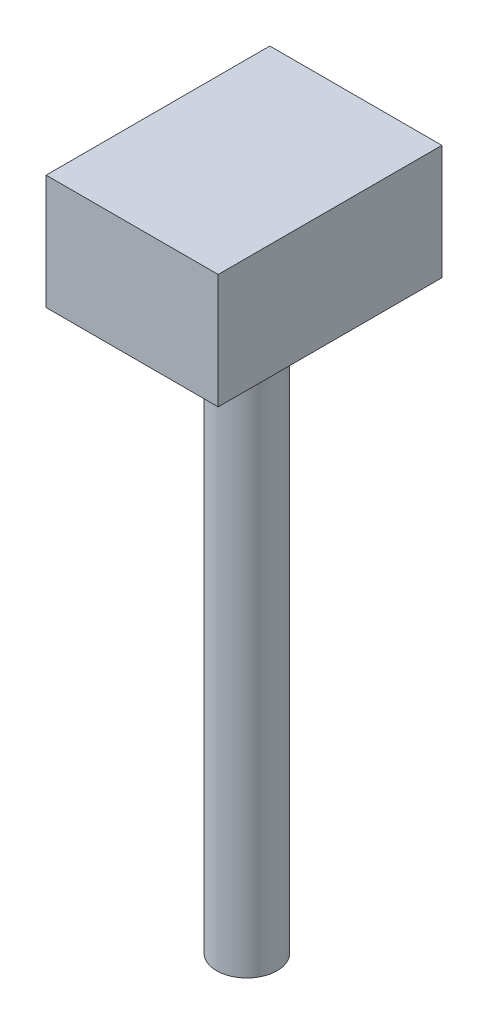
ISO-10303-21;
HEADER;
FILE_DESCRIPTION(('STEP AP214'),'2;1');
FILE_NAME('part.step','',(''),(''),'','','');
FILE_SCHEMA(('AUTOMOTIVE_DESIGN { 1 0 10303 214 1 1 1 1 }'));
ENDSEC;
DATA;
#1=APPLICATION_CONTEXT('core data for automotive mechanical design processes');
#2=APPLICATION_PROTOCOL_DEFINITION('international standard','automotive_design',2000,#1);
#3=PRODUCT_CONTEXT('',#1,'mechanical');
#4=PRODUCT('Part','Part','',(#3));
#5=PRODUCT_RELATED_PRODUCT_CATEGORY('part','',(#4));
#6=PRODUCT_DEFINITION_FORMATION('','',#4);
#7=PRODUCT_DEFINITION_CONTEXT('part definition',#1,'design');
#8=PRODUCT_DEFINITION('design','',#6,#7);
#9=PRODUCT_DEFINITION_SHAPE('','',#8);
#10=(LENGTH_UNIT() NAMED_UNIT(*) SI_UNIT(.MILLI.,.METRE.));
#11=(NAMED_UNIT(*) PLANE_ANGLE_UNIT() SI_UNIT($,.RADIAN.));
#12=(NAMED_UNIT(*) SI_UNIT($,.STERADIAN.) SOLID_ANGLE_UNIT());
#13=UNCERTAINTY_MEASURE_WITH_UNIT(LENGTH_MEASURE(1.E-05),#10,'distance_accuracy_value','');
#14=(GEOMETRIC_REPRESENTATION_CONTEXT(3) GLOBAL_UNCERTAINTY_ASSIGNED_CONTEXT((#13)) GLOBAL_UNIT_ASSIGNED_CONTEXT((#10,
#11,#12)) REPRESENTATION_CONTEXT('',''));
#15=CARTESIAN_POINT('',(0.,0.,0.));
#16=DIRECTION('',(0.,0.,1.));
#17=DIRECTION('',(1.,0.,0.));
#18=AXIS2_PLACEMENT_3D('',#15,#16,#17);
#19=CARTESIAN_POINT('',(-24.9395760630972,27.9290165452646,400.));
#20=DIRECTION('',(1.,0.,0.));
#21=DIRECTION('',(0.,0.,-1.));
#22=AXIS2_PLACEMENT_3D('',#19,#20,#21);
#23=PLANE('',#22);
#24=DIRECTION('',(0.,0.,-1.));
#25=VECTOR('',#24,1.);
#26=CARTESIAN_POINT('',(-24.9395760630972,27.9290165452646,400.));
#27=LINE('',#26,#25);
#28=CARTESIAN_POINT('',(-24.9395760630972,27.9290165452646,400.));
#29=VERTEX_POINT('',#28);
#30=CARTESIAN_POINT('',(-24.9395760630972,27.9290165452646,10.));
#31=VERTEX_POINT('',#30);
#32=EDGE_CURVE('E117',#29,#31,#27,.T.);
#33=ORIENTED_EDGE('',*,*,#32,.T.);
#34=DIRECTION('',(0.,-1.,0.));
#35=VECTOR('',#34,1.);
#36=CARTESIAN_POINT('',(-24.9395760630972,328.095636941337,10.));
#37=LINE('',#36,#35);
#38=CARTESIAN_POINT('',(-24.9395760630972,-172.070983454735,10.));
#39=VERTEX_POINT('',#38);
#40=EDGE_CURVE('E47',#31,#39,#37,.T.);
#41=ORIENTED_EDGE('',*,*,#40,.T.);
#42=DIRECTION('',(0.,0.,-1.));
#43=VECTOR('',#42,1.);
#44=CARTESIAN_POINT('',(-24.9395760630972,-172.070983454735,400.));
#45=LINE('',#44,#43);
#46=CARTESIAN_POINT('',(-24.9395760630972,-172.070983454735,400.));
#47=VERTEX_POINT('',#46);
#48=EDGE_CURVE('E111',#47,#39,#45,.T.);
#49=ORIENTED_EDGE('',*,*,#48,.F.);
#50=DIRECTION('',(0.,-1.,0.));
#51=VECTOR('',#50,1.);
#52=CARTESIAN_POINT('',(-24.9395760630972,27.9290165452646,400.));
#53=LINE('',#52,#51);
#54=EDGE_CURVE('E127',#29,#47,#53,.T.);
#55=ORIENTED_EDGE('',*,*,#54,.F.);
#56=EDGE_LOOP('',(#33,#41,#49,#55));
#57=FACE_BOUND('',#56,.T.);
#58=ADVANCED_FACE('F33',(#57),#23,.F.);
#59=CARTESIAN_POINT('',(-24.9395760630972,-172.070983454735,400.));
#60=DIRECTION('',(0.,1.,0.));
#61=DIRECTION('',(0.,0.,1.));
#62=AXIS2_PLACEMENT_3D('',#59,#60,#61);
#63=PLANE('',#62);
#64=CARTESIAN_POINT('',(45.0604239369028,-172.070983454735,15.));
#65=DIRECTION('',(0.,-1.,0.));
#66=DIRECTION('',(0.,0.,1.));
#67=AXIS2_PLACEMENT_3D('',#64,#65,#66);
#68=CIRCLE('',#67,3.5);
#69=CARTESIAN_POINT('',(45.0604239369028,-172.070983454735,18.5));
#70=VERTEX_POINT('',#69);
#71=EDGE_CURVE('E163',#70,#70,#68,.T.);
#72=ORIENTED_EDGE('',*,*,#71,.F.);
#73=EDGE_LOOP('',(#72));
#74=FACE_BOUND('',#73,.T.);
#75=CARTESIAN_POINT('',(205.060423936903,-172.070983454735,15.));
#76=DIRECTION('',(0.,-1.,0.));
#77=DIRECTION('',(0.,0.,-1.));
#78=AXIS2_PLACEMENT_3D('',#75,#76,#77);
#79=CIRCLE('',#78,3.49999999999999);
#80=CARTESIAN_POINT('',(205.060423936903,-172.070983454735,11.5));
#81=VERTEX_POINT('',#80);
#82=EDGE_CURVE('E164',#81,#81,#79,.T.);
#83=ORIENTED_EDGE('',*,*,#82,.F.);
#84=EDGE_LOOP('',(#83));
#85=FACE_BOUND('',#84,.T.);
#86=CARTESIAN_POINT('',(125.060423936903,-172.070983454735,200.));
#87=DIRECTION('',(0.,-1.,0.));
#88=DIRECTION('',(0.,0.,-1.));
#89=AXIS2_PLACEMENT_3D('',#86,#87,#88);
#90=CIRCLE('',#89,52.8064596683049);
#91=CARTESIAN_POINT('',(125.060423936903,-172.070983454735,147.193540331695));
#92=VERTEX_POINT('',#91);
#93=EDGE_CURVE('E40',#92,#92,#90,.T.);
#94=ORIENTED_EDGE('',*,*,#93,.F.);
#95=EDGE_LOOP('',(#94));
#96=FACE_BOUND('',#95,.T.);
#97=ORIENTED_EDGE('',*,*,#48,.T.);
#98=DIRECTION('',(-1.,0.,0.));
#99=VECTOR('',#98,1.);
#100=CARTESIAN_POINT('',(-24.9395760630972,-172.070983454735,10.));
#101=LINE('',#100,#99);
#102=CARTESIAN_POINT('',(275.060423936903,-172.070983454735,10.));
#103=VERTEX_POINT('',#102);
#104=EDGE_CURVE('E97',#103,#39,#101,.T.);
#105=ORIENTED_EDGE('',*,*,#104,.F.);
#106=DIRECTION('',(0.,0.,-1.));
#107=VECTOR('',#106,1.);
#108=CARTESIAN_POINT('',(275.060423936903,-172.070983454735,400.));
#109=LINE('',#108,#107);
#110=CARTESIAN_POINT('',(275.060423936903,-172.070983454735,400.));
#111=VERTEX_POINT('',#110);
#112=EDGE_CURVE('E108',#111,#103,#109,.T.);
#113=ORIENTED_EDGE('',*,*,#112,.F.);
#114=DIRECTION('',(1.,0.,0.));
#115=VECTOR('',#114,1.);
#116=CARTESIAN_POINT('',(-24.9395760630972,-172.070983454735,400.));
#117=LINE('',#116,#115);
#118=EDGE_CURVE('E125',#47,#111,#117,.T.);
#119=ORIENTED_EDGE('',*,*,#118,.F.);
#120=EDGE_LOOP('',(#97,#105,#113,#119));
#121=FACE_BOUND('',#120,.T.);
#122=ADVANCED_FACE('F107',(#74,#85,#96,#121),#63,.F.);
#123=CARTESIAN_POINT('',(275.060423936903,27.9290165452646,400.));
#124=DIRECTION('',(-1.,0.,0.));
#125=DIRECTION('',(0.,0.,1.));
#126=AXIS2_PLACEMENT_3D('',#123,#124,#125);
#127=PLANE('',#126);
#128=ORIENTED_EDGE('',*,*,#112,.T.);
#129=DIRECTION('',(0.,-1.,0.));
#130=VECTOR('',#129,1.);
#131=CARTESIAN_POINT('',(275.060423936903,328.095636941337,10.));
#132=LINE('',#131,#130);
#133=CARTESIAN_POINT('',(275.060423936903,27.9290165452646,10.));
#134=VERTEX_POINT('',#133);
#135=EDGE_CURVE('E94',#134,#103,#132,.T.);
#136=ORIENTED_EDGE('',*,*,#135,.F.);
#137=DIRECTION('',(0.,0.,-1.));
#138=VECTOR('',#137,1.);
#139=CARTESIAN_POINT('',(275.060423936903,27.9290165452646,400.));
#140=LINE('',#139,#138);
#141=CARTESIAN_POINT('',(275.060423936903,27.9290165452646,400.));
#142=VERTEX_POINT('',#141);
#143=EDGE_CURVE('E115',#142,#134,#140,.T.);
#144=ORIENTED_EDGE('',*,*,#143,.F.);
#145=DIRECTION('',(0.,1.,0.));
#146=VECTOR('',#145,1.);
#147=CARTESIAN_POINT('',(275.060423936903,27.9290165452646,400.));
#148=LINE('',#147,#146);
#149=EDGE_CURVE('E114',#111,#142,#148,.T.);
#150=ORIENTED_EDGE('',*,*,#149,.F.);
#151=EDGE_LOOP('',(#128,#136,#144,#150));
#152=FACE_BOUND('',#151,.T.);
#153=ADVANCED_FACE('F113',(#152),#127,.F.);
#154=CARTESIAN_POINT('',(-24.9395760630972,27.9290165452646,400.));
#155=DIRECTION('',(0.,-1.,0.));
#156=DIRECTION('',(1.,0.,0.));
#157=AXIS2_PLACEMENT_3D('',#154,#155,#156);
#158=PLANE('',#157);
#159=ORIENTED_EDGE('',*,*,#143,.T.);
#160=DIRECTION('',(1.,0.,0.));
#161=VECTOR('',#160,1.);
#162=CARTESIAN_POINT('',(-24.9395760630972,27.9290165452646,10.));
#163=LINE('',#162,#161);
#164=EDGE_CURVE('E98',#31,#134,#163,.T.);
#165=ORIENTED_EDGE('',*,*,#164,.F.);
#166=ORIENTED_EDGE('',*,*,#32,.F.);
#167=DIRECTION('',(-1.,0.,0.));
#168=VECTOR('',#167,1.);
#169=CARTESIAN_POINT('',(-24.9395760630972,27.9290165452646,400.));
#170=LINE('',#169,#168);
#171=EDGE_CURVE('E122',#142,#29,#170,.T.);
#172=ORIENTED_EDGE('',*,*,#171,.F.);
#173=EDGE_LOOP('',(#159,#165,#166,#172));
#174=FACE_BOUND('',#173,.T.);
#175=ADVANCED_FACE('F184',(#174),#158,.F.);
#176=CARTESIAN_POINT('',(0.,0.,400.));
#177=DIRECTION('',(0.,0.,1.));
#178=DIRECTION('',(1.,0.,0.));
#179=AXIS2_PLACEMENT_3D('',#176,#177,#178);
#180=PLANE('',#179);
#181=ORIENTED_EDGE('',*,*,#54,.T.);
#182=ORIENTED_EDGE('',*,*,#118,.T.);
#183=ORIENTED_EDGE('',*,*,#149,.T.);
#184=ORIENTED_EDGE('',*,*,#171,.T.);
#185=EDGE_LOOP('',(#181,#182,#183,#184));
#186=FACE_BOUND('',#185,.T.);
#187=ADVANCED_FACE('F186',(#186),#180,.T.);
#188=CARTESIAN_POINT('',(265.060423936903,22.9290165452646,390.));
#189=DIRECTION('',(1.,0.,0.));
#190=DIRECTION('',(0.,1.,0.));
#191=AXIS2_PLACEMENT_3D('',#188,#189,#190);
#192=PLANE('',#191);
#193=DIRECTION('',(0.,0.,-1.));
#194=VECTOR('',#193,1.);
#195=CARTESIAN_POINT('',(265.060423936903,22.9290165452646,390.));
#196=LINE('',#195,#194);
#197=CARTESIAN_POINT('',(265.060423936903,22.9290165452646,390.));
#198=VERTEX_POINT('',#197);
#199=CARTESIAN_POINT('',(265.060423936903,22.9290165452646,10.));
#200=VERTEX_POINT('',#199);
#201=EDGE_CURVE('E130',#198,#200,#196,.T.);
#202=ORIENTED_EDGE('',*,*,#201,.T.);
#203=DIRECTION('',(0.,-1.,0.));
#204=VECTOR('',#203,1.);
#205=CARTESIAN_POINT('',(265.060423936903,22.9290165452646,10.));
#206=LINE('',#205,#204);
#207=CARTESIAN_POINT('',(265.060423936903,-167.070983454735,10.));
#208=VERTEX_POINT('',#207);
#209=EDGE_CURVE('E167',#200,#208,#206,.T.);
#210=ORIENTED_EDGE('',*,*,#209,.T.);
#211=DIRECTION('',(0.,0.,-1.));
#212=VECTOR('',#211,1.);
#213=CARTESIAN_POINT('',(265.060423936903,-167.070983454735,390.));
#214=LINE('',#213,#212);
#215=CARTESIAN_POINT('',(265.060423936903,-167.070983454735,390.));
#216=VERTEX_POINT('',#215);
#217=EDGE_CURVE('E131',#216,#208,#214,.T.);
#218=ORIENTED_EDGE('',*,*,#217,.F.);
#219=DIRECTION('',(0.,-1.,0.));
#220=VECTOR('',#219,1.);
#221=CARTESIAN_POINT('',(265.060423936903,22.9290165452646,390.));
#222=LINE('',#221,#220);
#223=EDGE_CURVE('E151',#198,#216,#222,.T.);
#224=ORIENTED_EDGE('',*,*,#223,.F.);
#225=EDGE_LOOP('',(#202,#210,#218,#224));
#226=FACE_BOUND('',#225,.T.);
#227=ADVANCED_FACE('F188',(#226),#192,.F.);
#228=CARTESIAN_POINT('',(265.060423936903,22.9290165452646,390.));
#229=DIRECTION('',(0.,1.,0.));
#230=DIRECTION('',(-1.,0.,0.));
#231=AXIS2_PLACEMENT_3D('',#228,#229,#230);
#232=PLANE('',#231);
#233=DIRECTION('',(0.,0.,-1.));
#234=VECTOR('',#233,1.);
#235=CARTESIAN_POINT('',(-14.9395760630972,22.9290165452646,390.));
#236=LINE('',#235,#234);
#237=CARTESIAN_POINT('',(-14.9395760630972,22.9290165452646,390.));
#238=VERTEX_POINT('',#237);
#239=CARTESIAN_POINT('',(-14.9395760630972,22.9290165452646,10.));
#240=VERTEX_POINT('',#239);
#241=EDGE_CURVE('E138',#238,#240,#236,.T.);
#242=ORIENTED_EDGE('',*,*,#241,.T.);
#243=DIRECTION('',(1.,0.,0.));
#244=VECTOR('',#243,1.);
#245=CARTESIAN_POINT('',(265.060423936903,22.9290165452646,10.));
#246=LINE('',#245,#244);
#247=EDGE_CURVE('E174',#240,#200,#246,.T.);
#248=ORIENTED_EDGE('',*,*,#247,.T.);
#249=ORIENTED_EDGE('',*,*,#201,.F.);
#250=DIRECTION('',(1.,0.,0.));
#251=VECTOR('',#250,1.);
#252=CARTESIAN_POINT('',(265.060423936903,22.9290165452646,390.));
#253=LINE('',#252,#251);
#254=EDGE_CURVE('E135',#238,#198,#253,.T.);
#255=ORIENTED_EDGE('',*,*,#254,.F.);
#256=EDGE_LOOP('',(#242,#248,#249,#255));
#257=FACE_BOUND('',#256,.T.);
#258=ADVANCED_FACE('F195',(#257),#232,.F.);
#259=CARTESIAN_POINT('',(-14.9395760630972,22.9290165452646,390.));
#260=DIRECTION('',(-1.,0.,0.));
#261=DIRECTION('',(0.,-1.,0.));
#262=AXIS2_PLACEMENT_3D('',#259,#260,#261);
#263=PLANE('',#262);
#264=DIRECTION('',(0.,0.,-1.));
#265=VECTOR('',#264,1.);
#266=CARTESIAN_POINT('',(-14.9395760630972,-167.070983454735,390.));
#267=LINE('',#266,#265);
#268=CARTESIAN_POINT('',(-14.9395760630972,-167.070983454735,390.));
#269=VERTEX_POINT('',#268);
#270=CARTESIAN_POINT('',(-14.9395760630972,-167.070983454735,10.));
#271=VERTEX_POINT('',#270);
#272=EDGE_CURVE('E134',#269,#271,#267,.T.);
#273=ORIENTED_EDGE('',*,*,#272,.T.);
#274=DIRECTION('',(0.,1.,0.));
#275=VECTOR('',#274,1.);
#276=CARTESIAN_POINT('',(-14.9395760630972,22.9290165452646,10.));
#277=LINE('',#276,#275);
#278=EDGE_CURVE('E55',#271,#240,#277,.T.);
#279=ORIENTED_EDGE('',*,*,#278,.T.);
#280=ORIENTED_EDGE('',*,*,#241,.F.);
#281=DIRECTION('',(0.,1.,0.));
#282=VECTOR('',#281,1.);
#283=CARTESIAN_POINT('',(-14.9395760630972,22.9290165452646,390.));
#284=LINE('',#283,#282);
#285=EDGE_CURVE('E145',#269,#238,#284,.T.);
#286=ORIENTED_EDGE('',*,*,#285,.F.);
#287=EDGE_LOOP('',(#273,#279,#280,#286));
#288=FACE_BOUND('',#287,.T.);
#289=ADVANCED_FACE('F237',(#288),#263,.F.);
#290=CARTESIAN_POINT('',(265.060423936903,-167.070983454735,390.));
#291=DIRECTION('',(0.,-1.,0.));
#292=DIRECTION('',(0.,0.,-1.));
#293=AXIS2_PLACEMENT_3D('',#290,#291,#292);
#294=PLANE('',#293);
#295=CARTESIAN_POINT('',(45.0604239369028,-167.070983454735,15.));
#296=DIRECTION('',(0.,-1.,0.));
#297=DIRECTION('',(0.,0.,-1.));
#298=AXIS2_PLACEMENT_3D('',#295,#296,#297);
#299=CIRCLE('',#298,3.5);
#300=CARTESIAN_POINT('',(45.0604239369028,-167.070983454735,11.5));
#301=VERTEX_POINT('',#300);
#302=EDGE_CURVE('E159',#301,#301,#299,.F.);
#303=ORIENTED_EDGE('',*,*,#302,.F.);
#304=EDGE_LOOP('',(#303));
#305=FACE_BOUND('',#304,.T.);
#306=CARTESIAN_POINT('',(205.060423936903,-167.070983454735,15.));
#307=DIRECTION('',(0.,-1.,0.));
#308=DIRECTION('',(0.,0.,-1.));
#309=AXIS2_PLACEMENT_3D('',#306,#307,#308);
#310=CIRCLE('',#309,3.49999999999999);
#311=CARTESIAN_POINT('',(205.060423936903,-167.070983454735,11.5));
#312=VERTEX_POINT('',#311);
#313=EDGE_CURVE('E160',#312,#312,#310,.F.);
#314=ORIENTED_EDGE('',*,*,#313,.F.);
#315=EDGE_LOOP('',(#314));
#316=FACE_BOUND('',#315,.T.);
#317=ORIENTED_EDGE('',*,*,#217,.T.);
#318=DIRECTION('',(-1.,0.,0.));
#319=VECTOR('',#318,1.);
#320=CARTESIAN_POINT('',(265.060423936903,-167.070983454735,10.));
#321=LINE('',#320,#319);
#322=EDGE_CURVE('E11',#208,#271,#321,.T.);
#323=ORIENTED_EDGE('',*,*,#322,.T.);
#324=ORIENTED_EDGE('',*,*,#272,.F.);
#325=DIRECTION('',(-1.,0.,0.));
#326=VECTOR('',#325,1.);
#327=CARTESIAN_POINT('',(265.060423936903,-167.070983454735,390.));
#328=LINE('',#327,#326);
#329=EDGE_CURVE('E148',#216,#269,#328,.T.);
#330=ORIENTED_EDGE('',*,*,#329,.F.);
#331=EDGE_LOOP('',(#317,#323,#324,#330));
#332=FACE_BOUND('',#331,.T.);
#333=ADVANCED_FACE('F229',(#305,#316,#332),#294,.F.);
#334=CARTESIAN_POINT('',(0.,0.,390.));
#335=DIRECTION('',(0.,0.,-1.));
#336=DIRECTION('',(-1.,0.,0.));
#337=AXIS2_PLACEMENT_3D('',#334,#335,#336);
#338=PLANE('',#337);
#339=ORIENTED_EDGE('',*,*,#223,.T.);
#340=ORIENTED_EDGE('',*,*,#329,.T.);
#341=ORIENTED_EDGE('',*,*,#285,.T.);
#342=ORIENTED_EDGE('',*,*,#254,.T.);
#343=EDGE_LOOP('',(#339,#340,#341,#342));
#344=FACE_BOUND('',#343,.T.);
#345=ADVANCED_FACE('F219',(#344),#338,.T.);
#346=CARTESIAN_POINT('',(125.060423936903,-1172.07098345474,200.));
#347=DIRECTION('',(0.,1.,0.));
#348=DIRECTION('',(0.,0.,1.));
#349=AXIS2_PLACEMENT_3D('',#346,#347,#348);
#350=CYLINDRICAL_SURFACE('',#349,52.8064596683049);
#351=CARTESIAN_POINT('',(125.060423936903,-1172.07098345474,200.));
#352=DIRECTION('',(0.,-1.,0.));
#353=DIRECTION('',(0.,0.,-1.));
#354=AXIS2_PLACEMENT_3D('',#351,#352,#353);
#355=CIRCLE('',#354,52.8064596683049);
#356=CARTESIAN_POINT('',(125.060423936903,-1172.07098345474,147.193540331695));
#357=VERTEX_POINT('',#356);
#358=EDGE_CURVE('E154',#357,#357,#355,.T.);
#359=ORIENTED_EDGE('',*,*,#358,.F.);
#360=EDGE_LOOP('',(#359));
#361=FACE_BOUND('',#360,.T.);
#362=ORIENTED_EDGE('',*,*,#93,.T.);
#363=EDGE_LOOP('',(#362));
#364=FACE_BOUND('',#363,.T.);
#365=ADVANCED_FACE('F216',(#361,#364),#350,.T.);
#366=CARTESIAN_POINT('',(125.060423936903,-1172.07098345474,200.));
#367=DIRECTION('',(0.,-1.,0.));
#368=DIRECTION('',(0.,0.,-1.));
#369=AXIS2_PLACEMENT_3D('',#366,#367,#368);
#370=PLANE('',#369);
#371=ORIENTED_EDGE('',*,*,#358,.T.);
#372=EDGE_LOOP('',(#371));
#373=FACE_BOUND('',#372,.T.);
#374=ADVANCED_FACE('F218',(#373),#370,.T.);
#375=CARTESIAN_POINT('',(205.060423936903,-157.171488518124,15.));
#376=DIRECTION('',(0.,-1.,0.));
#377=DIRECTION('',(0.,0.,-1.));
#378=AXIS2_PLACEMENT_3D('',#375,#376,#377);
#379=CYLINDRICAL_SURFACE('',#378,3.49999999999999);
#380=ORIENTED_EDGE('',*,*,#313,.T.);
#381=EDGE_LOOP('',(#380));
#382=FACE_BOUND('',#381,.T.);
#383=ORIENTED_EDGE('',*,*,#82,.T.);
#384=EDGE_LOOP('',(#383));
#385=FACE_BOUND('',#384,.T.);
#386=ADVANCED_FACE('F226',(#382,#385),#379,.F.);
#387=CARTESIAN_POINT('',(45.0604239369028,-157.171488518124,15.));
#388=DIRECTION('',(0.,-1.,0.));
#389=DIRECTION('',(0.,0.,-1.));
#390=AXIS2_PLACEMENT_3D('',#387,#388,#389);
#391=CYLINDRICAL_SURFACE('',#390,3.5);
#392=ORIENTED_EDGE('',*,*,#302,.T.);
#393=EDGE_LOOP('',(#392));
#394=FACE_BOUND('',#393,.T.);
#395=ORIENTED_EDGE('',*,*,#71,.T.);
#396=EDGE_LOOP('',(#395));
#397=FACE_BOUND('',#396,.T.);
#398=ADVANCED_FACE('F256',(#394,#397),#391,.F.);
#399=CARTESIAN_POINT('',(-24.9395760630972,328.095636941337,10.));
#400=DIRECTION('',(0.,0.,1.));
#401=DIRECTION('',(1.,0.,0.));
#402=AXIS2_PLACEMENT_3D('',#399,#400,#401);
#403=PLANE('',#402);
#404=ORIENTED_EDGE('',*,*,#164,.T.);
#405=ORIENTED_EDGE('',*,*,#135,.T.);
#406=ORIENTED_EDGE('',*,*,#104,.T.);
#407=ORIENTED_EDGE('',*,*,#40,.F.);
#408=EDGE_LOOP('',(#404,#405,#406,#407));
#409=FACE_BOUND('',#408,.T.);
#410=ORIENTED_EDGE('',*,*,#247,.F.);
#411=ORIENTED_EDGE('',*,*,#278,.F.);
#412=ORIENTED_EDGE('',*,*,#322,.F.);
#413=ORIENTED_EDGE('',*,*,#209,.F.);
#414=EDGE_LOOP('',(#410,#411,#412,#413));
#415=FACE_BOUND('',#414,.T.);
#416=ADVANCED_FACE('F96',(#409,#415),#403,.F.);
#417=CLOSED_SHELL('',(#58,#122,#153,#175,#187,#227,#258,#289,#333,#345,#365,#374,#386,#398,#416));
#418=MANIFOLD_SOLID_BREP('B2',#417);
#419=ADVANCED_BREP_SHAPE_REPRESENTATION('',(#18,#418),#14);
#420=SHAPE_DEFINITION_REPRESENTATION(#9,#419);
ENDSEC;
END-ISO-10303-21;
